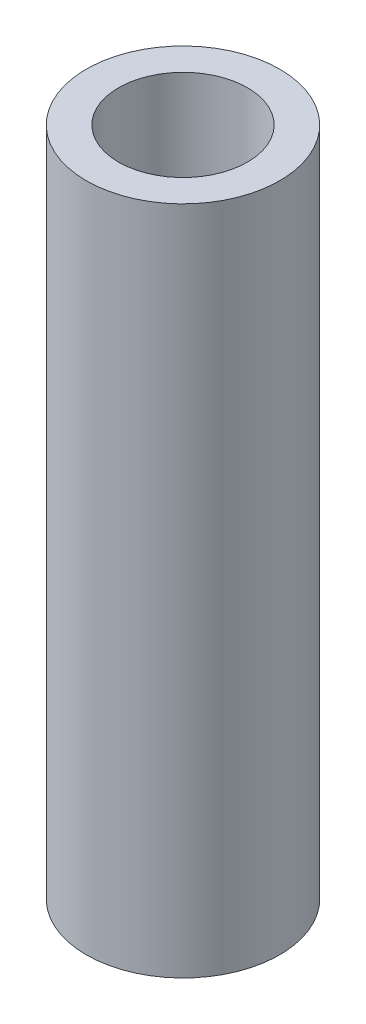
ISO-10303-21;
HEADER;
FILE_DESCRIPTION(('STEP AP214'),'2;1');
FILE_NAME('part.step','',(''),(''),'','','');
FILE_SCHEMA(('AUTOMOTIVE_DESIGN { 1 0 10303 214 1 1 1 1 }'));
ENDSEC;
DATA;
#1=APPLICATION_CONTEXT('core data for automotive mechanical design processes');
#2=APPLICATION_PROTOCOL_DEFINITION('international standard','automotive_design',2000,#1);
#3=PRODUCT_CONTEXT('',#1,'mechanical');
#4=PRODUCT('Part','Part','',(#3));
#5=PRODUCT_RELATED_PRODUCT_CATEGORY('part','',(#4));
#6=PRODUCT_DEFINITION_FORMATION('','',#4);
#7=PRODUCT_DEFINITION_CONTEXT('part definition',#1,'design');
#8=PRODUCT_DEFINITION('design','',#6,#7);
#9=PRODUCT_DEFINITION_SHAPE('','',#8);
#10=(LENGTH_UNIT() NAMED_UNIT(*) SI_UNIT(.MILLI.,.METRE.));
#11=(NAMED_UNIT(*) PLANE_ANGLE_UNIT() SI_UNIT($,.RADIAN.));
#12=(NAMED_UNIT(*) SI_UNIT($,.STERADIAN.) SOLID_ANGLE_UNIT());
#13=UNCERTAINTY_MEASURE_WITH_UNIT(LENGTH_MEASURE(1.E-05),#10,'distance_accuracy_value','');
#14=(GEOMETRIC_REPRESENTATION_CONTEXT(3) GLOBAL_UNCERTAINTY_ASSIGNED_CONTEXT((#13)) GLOBAL_UNIT_ASSIGNED_CONTEXT((#10,
#11,#12)) REPRESENTATION_CONTEXT('',''));
#15=CARTESIAN_POINT('',(0.,0.,0.));
#16=DIRECTION('',(0.,0.,1.));
#17=DIRECTION('',(1.,0.,0.));
#18=AXIS2_PLACEMENT_3D('',#15,#16,#17);
#19=CARTESIAN_POINT('',(0.,-33.02,0.));
#20=DIRECTION('',(0.,1.,0.));
#21=DIRECTION('',(0.,0.,1.));
#22=AXIS2_PLACEMENT_3D('',#19,#20,#21);
#23=CYLINDRICAL_SURFACE('',#22,4.7625);
#24=CARTESIAN_POINT('',(0.,-33.02,0.));
#25=DIRECTION('',(0.,1.,0.));
#26=DIRECTION('',(0.,0.,1.));
#27=AXIS2_PLACEMENT_3D('',#24,#25,#26);
#28=CIRCLE('',#27,4.7625);
#29=CARTESIAN_POINT('',(0.,-33.02,4.7625));
#30=VERTEX_POINT('',#29);
#31=EDGE_CURVE('E10',#30,#30,#28,.T.);
#32=ORIENTED_EDGE('',*,*,#31,.T.);
#33=EDGE_LOOP('',(#32));
#34=FACE_BOUND('',#33,.T.);
#35=CARTESIAN_POINT('',(0.,0.,0.));
#36=DIRECTION('',(0.,1.,0.));
#37=DIRECTION('',(0.,0.,1.));
#38=AXIS2_PLACEMENT_3D('',#35,#36,#37);
#39=CIRCLE('',#38,4.7625);
#40=CARTESIAN_POINT('',(0.,0.,4.7625));
#41=VERTEX_POINT('',#40);
#42=EDGE_CURVE('E42',#41,#41,#39,.T.);
#43=ORIENTED_EDGE('',*,*,#42,.F.);
#44=EDGE_LOOP('',(#43));
#45=FACE_BOUND('',#44,.T.);
#46=ADVANCED_FACE('F39',(#34,#45),#23,.T.);
#47=CARTESIAN_POINT('',(0.,-33.02,0.));
#48=DIRECTION('',(0.,1.,0.));
#49=DIRECTION('',(0.,0.,1.));
#50=AXIS2_PLACEMENT_3D('',#47,#48,#49);
#51=PLANE('',#50);
#52=CARTESIAN_POINT('',(0.,-33.02,0.));
#53=DIRECTION('',(0.,1.,0.));
#54=DIRECTION('',(0.,0.,1.));
#55=AXIS2_PLACEMENT_3D('',#52,#53,#54);
#56=CIRCLE('',#55,3.175);
#57=CARTESIAN_POINT('',(0.,-33.02,3.175));
#58=VERTEX_POINT('',#57);
#59=EDGE_CURVE('E49',#58,#58,#56,.T.);
#60=ORIENTED_EDGE('',*,*,#59,.T.);
#61=EDGE_LOOP('',(#60));
#62=FACE_BOUND('',#61,.T.);
#63=ORIENTED_EDGE('',*,*,#31,.F.);
#64=EDGE_LOOP('',(#63));
#65=FACE_BOUND('',#64,.T.);
#66=ADVANCED_FACE('F57',(#62,#65),#51,.F.);
#67=CARTESIAN_POINT('',(0.,0.,0.));
#68=DIRECTION('',(0.,1.,0.));
#69=DIRECTION('',(0.,0.,1.));
#70=AXIS2_PLACEMENT_3D('',#67,#68,#69);
#71=PLANE('',#70);
#72=CARTESIAN_POINT('',(0.,0.,0.));
#73=DIRECTION('',(0.,1.,0.));
#74=DIRECTION('',(0.,0.,1.));
#75=AXIS2_PLACEMENT_3D('',#72,#73,#74);
#76=CIRCLE('',#75,3.175);
#77=CARTESIAN_POINT('',(0.,0.,3.175));
#78=VERTEX_POINT('',#77);
#79=EDGE_CURVE('E51',#78,#78,#76,.T.);
#80=ORIENTED_EDGE('',*,*,#79,.F.);
#81=EDGE_LOOP('',(#80));
#82=FACE_BOUND('',#81,.T.);
#83=ORIENTED_EDGE('',*,*,#42,.T.);
#84=EDGE_LOOP('',(#83));
#85=FACE_BOUND('',#84,.T.);
#86=ADVANCED_FACE('F63',(#82,#85),#71,.T.);
#87=CARTESIAN_POINT('',(0.,-33.02,0.));
#88=DIRECTION('',(0.,1.,0.));
#89=DIRECTION('',(0.,0.,1.));
#90=AXIS2_PLACEMENT_3D('',#87,#88,#89);
#91=CYLINDRICAL_SURFACE('',#90,3.175);
#92=ORIENTED_EDGE('',*,*,#59,.F.);
#93=EDGE_LOOP('',(#92));
#94=FACE_BOUND('',#93,.T.);
#95=ORIENTED_EDGE('',*,*,#79,.T.);
#96=EDGE_LOOP('',(#95));
#97=FACE_BOUND('',#96,.T.);
#98=ADVANCED_FACE('F60',(#94,#97),#91,.F.);
#99=CLOSED_SHELL('',(#46,#66,#86,#98));
#100=MANIFOLD_SOLID_BREP('B2',#99);
#101=ADVANCED_BREP_SHAPE_REPRESENTATION('',(#18,#100),#14);
#102=SHAPE_DEFINITION_REPRESENTATION(#9,#101);
ENDSEC;
END-ISO-10303-21;
